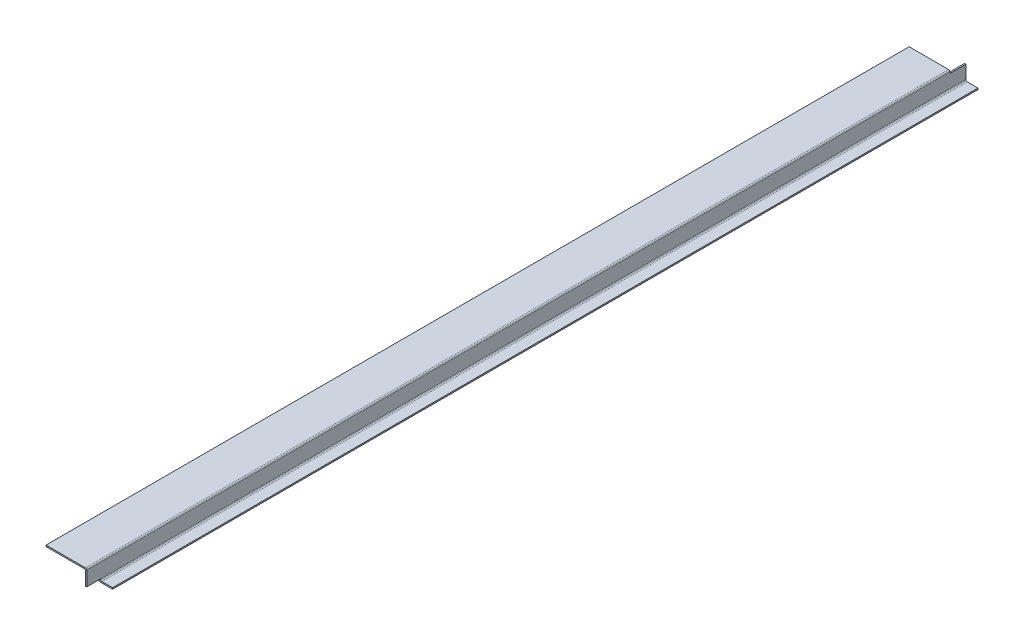
ISO-10303-21;
HEADER;
FILE_DESCRIPTION(('STEP AP214'),'2;1');
FILE_NAME('part.step','',(''),(''),'','','');
FILE_SCHEMA(('AUTOMOTIVE_DESIGN { 1 0 10303 214 1 1 1 1 }'));
ENDSEC;
DATA;
#1=APPLICATION_CONTEXT('core data for automotive mechanical design processes');
#2=APPLICATION_PROTOCOL_DEFINITION('international standard','automotive_design',2000,#1);
#3=PRODUCT_CONTEXT('',#1,'mechanical');
#4=PRODUCT('Part','Part','',(#3));
#5=PRODUCT_RELATED_PRODUCT_CATEGORY('part','',(#4));
#6=PRODUCT_DEFINITION_FORMATION('','',#4);
#7=PRODUCT_DEFINITION_CONTEXT('part definition',#1,'design');
#8=PRODUCT_DEFINITION('design','',#6,#7);
#9=PRODUCT_DEFINITION_SHAPE('','',#8);
#10=(LENGTH_UNIT() NAMED_UNIT(*) SI_UNIT(.MILLI.,.METRE.));
#11=(NAMED_UNIT(*) PLANE_ANGLE_UNIT() SI_UNIT($,.RADIAN.));
#12=(NAMED_UNIT(*) SI_UNIT($,.STERADIAN.) SOLID_ANGLE_UNIT());
#13=UNCERTAINTY_MEASURE_WITH_UNIT(LENGTH_MEASURE(1.E-05),#10,'distance_accuracy_value','');
#14=(GEOMETRIC_REPRESENTATION_CONTEXT(3) GLOBAL_UNCERTAINTY_ASSIGNED_CONTEXT((#13)) GLOBAL_UNIT_ASSIGNED_CONTEXT((#10,
#11,#12)) REPRESENTATION_CONTEXT('',''));
#15=CARTESIAN_POINT('',(0.,0.,0.));
#16=DIRECTION('',(0.,0.,1.));
#17=DIRECTION('',(1.,0.,0.));
#18=AXIS2_PLACEMENT_3D('',#15,#16,#17);
#19=CARTESIAN_POINT('',(0.,0.,0.));
#20=DIRECTION('',(0.,0.,1.));
#21=DIRECTION('',(1.,0.,0.));
#22=AXIS2_PLACEMENT_3D('',#19,#20,#21);
#23=PLANE('',#22);
#24=DIRECTION('',(-1.,0.,0.));
#25=VECTOR('',#24,1.);
#26=CARTESIAN_POINT('',(90.,-3.,0.));
#27=LINE('',#26,#25);
#28=CARTESIAN_POINT('',(90.,-3.,0.));
#29=VERTEX_POINT('',#28);
#30=CARTESIAN_POINT('',(87.,-3.,0.));
#31=VERTEX_POINT('',#30);
#32=EDGE_CURVE('E260',#29,#31,#27,.T.);
#33=ORIENTED_EDGE('',*,*,#32,.F.);
#34=DIRECTION('',(0.,1.,0.));
#35=VECTOR('',#34,1.);
#36=CARTESIAN_POINT('',(90.,3.,0.));
#37=LINE('',#36,#35);
#38=CARTESIAN_POINT('',(90.,-32.,0.));
#39=VERTEX_POINT('',#38);
#40=EDGE_CURVE('E190',#39,#29,#37,.T.);
#41=ORIENTED_EDGE('',*,*,#40,.F.);
#42=CARTESIAN_POINT('',(93.,-32.,0.));
#43=DIRECTION('',(0.,0.,1.));
#44=DIRECTION('',(1.,0.,0.));
#45=AXIS2_PLACEMENT_3D('',#42,#43,#44);
#46=CIRCLE('',#45,3.);
#47=CARTESIAN_POINT('',(93.,-35.,0.));
#48=VERTEX_POINT('',#47);
#49=EDGE_CURVE('E226',#39,#48,#46,.T.);
#50=ORIENTED_EDGE('',*,*,#49,.T.);
#51=DIRECTION('',(-1.,0.,0.));
#52=VECTOR('',#51,1.);
#53=CARTESIAN_POINT('',(90.,-35.,0.));
#54=LINE('',#53,#52);
#55=CARTESIAN_POINT('',(117.,-35.,0.));
#56=VERTEX_POINT('',#55);
#57=EDGE_CURVE('E187',#56,#48,#54,.T.);
#58=ORIENTED_EDGE('',*,*,#57,.F.);
#59=DIRECTION('',(0.,1.,0.));
#60=VECTOR('',#59,1.);
#61=CARTESIAN_POINT('',(117.,-35.,0.));
#62=LINE('',#61,#60);
#63=CARTESIAN_POINT('',(117.,-38.,0.));
#64=VERTEX_POINT('',#63);
#65=EDGE_CURVE('E184',#64,#56,#62,.T.);
#66=ORIENTED_EDGE('',*,*,#65,.F.);
#67=DIRECTION('',(1.,0.,0.));
#68=VECTOR('',#67,1.);
#69=CARTESIAN_POINT('',(87.,-38.,0.));
#70=LINE('',#69,#68);
#71=CARTESIAN_POINT('',(90.,-38.,0.));
#72=VERTEX_POINT('',#71);
#73=EDGE_CURVE('E180',#72,#64,#70,.T.);
#74=ORIENTED_EDGE('',*,*,#73,.F.);
#75=CARTESIAN_POINT('',(90.,-35.,0.));
#76=DIRECTION('',(0.,0.,1.));
#77=DIRECTION('',(1.,0.,0.));
#78=AXIS2_PLACEMENT_3D('',#75,#76,#77);
#79=CIRCLE('',#78,3.);
#80=CARTESIAN_POINT('',(87.,-35.,0.));
#81=VERTEX_POINT('',#80);
#82=EDGE_CURVE('E204',#72,#81,#79,.F.);
#83=ORIENTED_EDGE('',*,*,#82,.T.);
#84=DIRECTION('',(0.,-1.,0.));
#85=VECTOR('',#84,1.);
#86=CARTESIAN_POINT('',(87.,0.,0.));
#87=LINE('',#86,#85);
#88=EDGE_CURVE('E177',#31,#81,#87,.T.);
#89=ORIENTED_EDGE('',*,*,#88,.F.);
#90=EDGE_LOOP('',(#33,#41,#50,#58,#66,#74,#83,#89));
#91=FACE_BOUND('',#90,.T.);
#92=ADVANCED_FACE('F35',(#91),#23,.F.);
#93=CARTESIAN_POINT('',(0.,3.,1940.));
#94=DIRECTION('',(1.,0.,0.));
#95=DIRECTION('',(0.,0.,-1.));
#96=AXIS2_PLACEMENT_3D('',#93,#94,#95);
#97=PLANE('',#96);
#98=DIRECTION('',(0.,0.,-1.));
#99=VECTOR('',#98,1.);
#100=CARTESIAN_POINT('',(0.,3.,1940.));
#101=LINE('',#100,#99);
#102=CARTESIAN_POINT('',(0.,3.,1940.));
#103=VERTEX_POINT('',#102);
#104=CARTESIAN_POINT('',(0.,3.,34.9999999999999));
#105=VERTEX_POINT('',#104);
#106=EDGE_CURVE('E176',#103,#105,#101,.T.);
#107=ORIENTED_EDGE('',*,*,#106,.T.);
#108=DIRECTION('',(0.,1.,0.));
#109=VECTOR('',#108,1.);
#110=CARTESIAN_POINT('',(0.,-3.,34.9999999999999));
#111=LINE('',#110,#109);
#112=CARTESIAN_POINT('',(0.,0.,34.9999999999999));
#113=VERTEX_POINT('',#112);
#114=EDGE_CURVE('E240',#113,#105,#111,.T.);
#115=ORIENTED_EDGE('',*,*,#114,.F.);
#116=DIRECTION('',(0.,0.,-1.));
#117=VECTOR('',#116,1.);
#118=CARTESIAN_POINT('',(0.,0.,1940.));
#119=LINE('',#118,#117);
#120=CARTESIAN_POINT('',(0.,0.,1940.));
#121=VERTEX_POINT('',#120);
#122=EDGE_CURVE('E199',#121,#113,#119,.T.);
#123=ORIENTED_EDGE('',*,*,#122,.F.);
#124=DIRECTION('',(0.,-1.,0.));
#125=VECTOR('',#124,1.);
#126=CARTESIAN_POINT('',(0.,3.,1940.));
#127=LINE('',#126,#125);
#128=EDGE_CURVE('E171',#103,#121,#127,.T.);
#129=ORIENTED_EDGE('',*,*,#128,.F.);
#130=EDGE_LOOP('',(#107,#115,#123,#129));
#131=FACE_BOUND('',#130,.T.);
#132=ADVANCED_FACE('F252',(#131),#97,.F.);
#133=CARTESIAN_POINT('',(0.,0.,1940.));
#134=DIRECTION('',(0.,1.,0.));
#135=DIRECTION('',(0.,0.,1.));
#136=AXIS2_PLACEMENT_3D('',#133,#134,#135);
#137=PLANE('',#136);
#138=ORIENTED_EDGE('',*,*,#122,.T.);
#139=DIRECTION('',(1.,0.,0.));
#140=VECTOR('',#139,1.);
#141=CARTESIAN_POINT('',(0.,0.,34.9999999999999));
#142=LINE('',#141,#140);
#143=CARTESIAN_POINT('',(84.,0.,34.9999999999999));
#144=VERTEX_POINT('',#143);
#145=EDGE_CURVE('E181',#113,#144,#142,.T.);
#146=ORIENTED_EDGE('',*,*,#145,.T.);
#147=DIRECTION('',(0.,0.,-1.));
#148=VECTOR('',#147,1.);
#149=CARTESIAN_POINT('',(84.,0.,1940.));
#150=LINE('',#149,#148);
#151=CARTESIAN_POINT('',(84.,0.,1940.));
#152=VERTEX_POINT('',#151);
#153=EDGE_CURVE('E213',#144,#152,#150,.F.);
#154=ORIENTED_EDGE('',*,*,#153,.T.);
#155=DIRECTION('',(1.,0.,0.));
#156=VECTOR('',#155,1.);
#157=CARTESIAN_POINT('',(0.,0.,1940.));
#158=LINE('',#157,#156);
#159=EDGE_CURVE('E167',#121,#152,#158,.T.);
#160=ORIENTED_EDGE('',*,*,#159,.F.);
#161=EDGE_LOOP('',(#138,#146,#154,#160));
#162=FACE_BOUND('',#161,.T.);
#163=ADVANCED_FACE('F311',(#162),#137,.F.);
#164=CARTESIAN_POINT('',(87.,0.,1940.));
#165=DIRECTION('',(1.,0.,0.));
#166=DIRECTION('',(0.,1.,0.));
#167=AXIS2_PLACEMENT_3D('',#164,#165,#166);
#168=PLANE('',#167);
#169=DIRECTION('',(0.,0.,-1.));
#170=VECTOR('',#169,1.);
#171=CARTESIAN_POINT('',(87.,-35.,1940.));
#172=LINE('',#171,#170);
#173=CARTESIAN_POINT('',(87.,-35.,1910.));
#174=VERTEX_POINT('',#173);
#175=EDGE_CURVE('E209',#81,#174,#172,.F.);
#176=ORIENTED_EDGE('',*,*,#175,.T.);
#177=DIRECTION('',(0.,-1.,0.));
#178=VECTOR('',#177,1.);
#179=CARTESIAN_POINT('',(87.,-32.,1910.));
#180=LINE('',#179,#178);
#181=CARTESIAN_POINT('',(87.,-32.,1910.));
#182=VERTEX_POINT('',#181);
#183=EDGE_CURVE('E160',#182,#174,#180,.T.);
#184=ORIENTED_EDGE('',*,*,#183,.F.);
#185=DIRECTION('',(0.,0.,-1.));
#186=VECTOR('',#185,1.);
#187=CARTESIAN_POINT('',(87.,-32.,1910.));
#188=LINE('',#187,#186);
#189=CARTESIAN_POINT('',(87.,-32.,1940.));
#190=VERTEX_POINT('',#189);
#191=EDGE_CURVE('E143',#190,#182,#188,.T.);
#192=ORIENTED_EDGE('',*,*,#191,.F.);
#193=DIRECTION('',(0.,-1.,0.));
#194=VECTOR('',#193,1.);
#195=CARTESIAN_POINT('',(87.,0.,1940.));
#196=LINE('',#195,#194);
#197=CARTESIAN_POINT('',(87.,-3.,1940.));
#198=VERTEX_POINT('',#197);
#199=EDGE_CURVE('E158',#198,#190,#196,.T.);
#200=ORIENTED_EDGE('',*,*,#199,.F.);
#201=DIRECTION('',(0.,0.,-1.));
#202=VECTOR('',#201,1.);
#203=CARTESIAN_POINT('',(87.,-3.,0.));
#204=LINE('',#203,#202);
#205=CARTESIAN_POINT('',(87.,-3.,34.9999999999999));
#206=VERTEX_POINT('',#205);
#207=EDGE_CURVE('E207',#198,#206,#204,.T.);
#208=ORIENTED_EDGE('',*,*,#207,.T.);
#209=EDGE_CURVE('E206',#206,#31,#204,.T.);
#210=ORIENTED_EDGE('',*,*,#209,.T.);
#211=ORIENTED_EDGE('',*,*,#88,.T.);
#212=EDGE_LOOP('',(#176,#184,#192,#200,#208,#210,#211));
#213=FACE_BOUND('',#212,.T.);
#214=ADVANCED_FACE('F156',(#213),#168,.F.);
#215=CARTESIAN_POINT('',(87.,-38.,1940.));
#216=DIRECTION('',(0.,1.,0.));
#217=DIRECTION('',(0.,0.,1.));
#218=AXIS2_PLACEMENT_3D('',#215,#216,#217);
#219=PLANE('',#218);
#220=DIRECTION('',(0.,0.,-1.));
#221=VECTOR('',#220,1.);
#222=CARTESIAN_POINT('',(117.,-38.,1940.));
#223=LINE('',#222,#221);
#224=CARTESIAN_POINT('',(117.,-38.,1910.));
#225=VERTEX_POINT('',#224);
#226=EDGE_CURVE('E197',#225,#64,#223,.T.);
#227=ORIENTED_EDGE('',*,*,#226,.F.);
#228=DIRECTION('',(1.,0.,0.));
#229=VECTOR('',#228,1.);
#230=CARTESIAN_POINT('',(117.,-38.,1910.));
#231=LINE('',#230,#229);
#232=CARTESIAN_POINT('',(90.,-38.,1910.));
#233=VERTEX_POINT('',#232);
#234=EDGE_CURVE('E151',#233,#225,#231,.T.);
#235=ORIENTED_EDGE('',*,*,#234,.F.);
#236=DIRECTION('',(0.,0.,-1.));
#237=VECTOR('',#236,1.);
#238=CARTESIAN_POINT('',(90.,-38.,1940.));
#239=LINE('',#238,#237);
#240=EDGE_CURVE('E202',#233,#72,#239,.T.);
#241=ORIENTED_EDGE('',*,*,#240,.T.);
#242=ORIENTED_EDGE('',*,*,#73,.T.);
#243=EDGE_LOOP('',(#227,#235,#241,#242));
#244=FACE_BOUND('',#243,.T.);
#245=ADVANCED_FACE('F285',(#244),#219,.F.);
#246=CARTESIAN_POINT('',(117.,-35.,1940.));
#247=DIRECTION('',(-1.,0.,0.));
#248=DIRECTION('',(0.,0.,1.));
#249=AXIS2_PLACEMENT_3D('',#246,#247,#248);
#250=PLANE('',#249);
#251=DIRECTION('',(0.,0.,-1.));
#252=VECTOR('',#251,1.);
#253=CARTESIAN_POINT('',(117.,-35.,1940.));
#254=LINE('',#253,#252);
#255=CARTESIAN_POINT('',(117.,-35.,1910.));
#256=VERTEX_POINT('',#255);
#257=EDGE_CURVE('E195',#256,#56,#254,.T.);
#258=ORIENTED_EDGE('',*,*,#257,.F.);
#259=DIRECTION('',(0.,-1.,0.));
#260=VECTOR('',#259,1.);
#261=CARTESIAN_POINT('',(117.,-32.,1910.));
#262=LINE('',#261,#260);
#263=EDGE_CURVE('E270',#256,#225,#262,.T.);
#264=ORIENTED_EDGE('',*,*,#263,.T.);
#265=ORIENTED_EDGE('',*,*,#226,.T.);
#266=ORIENTED_EDGE('',*,*,#65,.T.);
#267=EDGE_LOOP('',(#258,#264,#265,#266));
#268=FACE_BOUND('',#267,.T.);
#269=ADVANCED_FACE('F284',(#268),#250,.F.);
#270=CARTESIAN_POINT('',(90.,-35.,1940.));
#271=DIRECTION('',(0.,-1.,0.));
#272=DIRECTION('',(0.,0.,-1.));
#273=AXIS2_PLACEMENT_3D('',#270,#271,#272);
#274=PLANE('',#273);
#275=DIRECTION('',(0.,0.,-1.));
#276=VECTOR('',#275,1.);
#277=CARTESIAN_POINT('',(93.,-35.,1940.));
#278=LINE('',#277,#276);
#279=CARTESIAN_POINT('',(93.,-35.,1910.));
#280=VERTEX_POINT('',#279);
#281=EDGE_CURVE('E219',#48,#280,#278,.F.);
#282=ORIENTED_EDGE('',*,*,#281,.T.);
#283=DIRECTION('',(1.,0.,0.));
#284=VECTOR('',#283,1.);
#285=CARTESIAN_POINT('',(90.,-35.,1910.));
#286=LINE('',#285,#284);
#287=EDGE_CURVE('E267',#280,#256,#286,.T.);
#288=ORIENTED_EDGE('',*,*,#287,.T.);
#289=ORIENTED_EDGE('',*,*,#257,.T.);
#290=ORIENTED_EDGE('',*,*,#57,.T.);
#291=EDGE_LOOP('',(#282,#288,#289,#290));
#292=FACE_BOUND('',#291,.T.);
#293=ADVANCED_FACE('F296',(#292),#274,.F.);
#294=CARTESIAN_POINT('',(90.,3.,1940.));
#295=DIRECTION('',(-1.,0.,0.));
#296=DIRECTION('',(0.,0.,1.));
#297=AXIS2_PLACEMENT_3D('',#294,#295,#296);
#298=PLANE('',#297);
#299=DIRECTION('',(0.,0.,-1.));
#300=VECTOR('',#299,1.);
#301=CARTESIAN_POINT('',(90.,-3.,34.9999999999999));
#302=LINE('',#301,#300);
#303=CARTESIAN_POINT('',(90.,-3.,34.9999999999999));
#304=VERTEX_POINT('',#303);
#305=EDGE_CURVE('E238',#304,#29,#302,.T.);
#306=ORIENTED_EDGE('',*,*,#305,.F.);
#307=DIRECTION('',(0.,1.,0.));
#308=VECTOR('',#307,1.);
#309=CARTESIAN_POINT('',(90.,-3.,34.9999999999999));
#310=LINE('',#309,#308);
#311=CARTESIAN_POINT('',(90.,0.,34.9999999999999));
#312=VERTEX_POINT('',#311);
#313=EDGE_CURVE('E231',#304,#312,#310,.T.);
#314=ORIENTED_EDGE('',*,*,#313,.T.);
#315=DIRECTION('',(0.,0.,-1.));
#316=VECTOR('',#315,1.);
#317=CARTESIAN_POINT('',(90.,0.,1940.));
#318=LINE('',#317,#316);
#319=CARTESIAN_POINT('',(90.,0.,1940.));
#320=VERTEX_POINT('',#319);
#321=EDGE_CURVE('E215',#312,#320,#318,.F.);
#322=ORIENTED_EDGE('',*,*,#321,.T.);
#323=DIRECTION('',(0.,1.,0.));
#324=VECTOR('',#323,1.);
#325=CARTESIAN_POINT('',(90.,3.,1940.));
#326=LINE('',#325,#324);
#327=CARTESIAN_POINT('',(90.,-32.,1940.));
#328=VERTEX_POINT('',#327);
#329=EDGE_CURVE('E166',#328,#320,#326,.T.);
#330=ORIENTED_EDGE('',*,*,#329,.F.);
#331=DIRECTION('',(0.,0.,-1.));
#332=VECTOR('',#331,1.);
#333=CARTESIAN_POINT('',(90.,-32.,0.));
#334=LINE('',#333,#332);
#335=CARTESIAN_POINT('',(90.,-32.,1910.));
#336=VERTEX_POINT('',#335);
#337=EDGE_CURVE('E146',#328,#336,#334,.T.);
#338=ORIENTED_EDGE('',*,*,#337,.T.);
#339=EDGE_CURVE('E217',#336,#39,#334,.T.);
#340=ORIENTED_EDGE('',*,*,#339,.T.);
#341=ORIENTED_EDGE('',*,*,#40,.T.);
#342=EDGE_LOOP('',(#306,#314,#322,#330,#338,#340,#341));
#343=FACE_BOUND('',#342,.T.);
#344=ADVANCED_FACE('F237',(#343),#298,.F.);
#345=CARTESIAN_POINT('',(0.,3.,1940.));
#346=DIRECTION('',(0.,-1.,0.));
#347=DIRECTION('',(0.,0.,-1.));
#348=AXIS2_PLACEMENT_3D('',#345,#346,#347);
#349=PLANE('',#348);
#350=DIRECTION('',(0.,0.,-1.));
#351=VECTOR('',#350,1.);
#352=CARTESIAN_POINT('',(87.,3.,1940.));
#353=LINE('',#352,#351);
#354=CARTESIAN_POINT('',(87.,3.,1940.));
#355=VERTEX_POINT('',#354);
#356=CARTESIAN_POINT('',(87.,3.,34.9999999999999));
#357=VERTEX_POINT('',#356);
#358=EDGE_CURVE('E222',#355,#357,#353,.T.);
#359=ORIENTED_EDGE('',*,*,#358,.T.);
#360=DIRECTION('',(1.,0.,0.));
#361=VECTOR('',#360,1.);
#362=CARTESIAN_POINT('',(0.,3.,34.9999999999999));
#363=LINE('',#362,#361);
#364=EDGE_CURVE('E58',#105,#357,#363,.T.);
#365=ORIENTED_EDGE('',*,*,#364,.F.);
#366=ORIENTED_EDGE('',*,*,#106,.F.);
#367=DIRECTION('',(-1.,0.,0.));
#368=VECTOR('',#367,1.);
#369=CARTESIAN_POINT('',(0.,3.,1940.));
#370=LINE('',#369,#368);
#371=EDGE_CURVE('E169',#355,#103,#370,.T.);
#372=ORIENTED_EDGE('',*,*,#371,.F.);
#373=EDGE_LOOP('',(#359,#365,#366,#372));
#374=FACE_BOUND('',#373,.T.);
#375=ADVANCED_FACE('F247',(#374),#349,.F.);
#376=CARTESIAN_POINT('',(0.,0.,1940.));
#377=DIRECTION('',(0.,0.,1.));
#378=DIRECTION('',(1.,0.,0.));
#379=AXIS2_PLACEMENT_3D('',#376,#377,#378);
#380=PLANE('',#379);
#381=DIRECTION('',(-1.,0.,0.));
#382=VECTOR('',#381,1.);
#383=CARTESIAN_POINT('',(87.,-32.,1940.));
#384=LINE('',#383,#382);
#385=EDGE_CURVE('E140',#328,#190,#384,.T.);
#386=ORIENTED_EDGE('',*,*,#385,.F.);
#387=ORIENTED_EDGE('',*,*,#329,.T.);
#388=CARTESIAN_POINT('',(87.,0.,1940.));
#389=DIRECTION('',(0.,0.,1.));
#390=DIRECTION('',(1.,0.,0.));
#391=AXIS2_PLACEMENT_3D('',#388,#389,#390);
#392=CIRCLE('',#391,3.);
#393=EDGE_CURVE('E211',#320,#355,#392,.T.);
#394=ORIENTED_EDGE('',*,*,#393,.T.);
#395=ORIENTED_EDGE('',*,*,#371,.T.);
#396=ORIENTED_EDGE('',*,*,#128,.T.);
#397=ORIENTED_EDGE('',*,*,#159,.T.);
#398=CARTESIAN_POINT('',(84.,-3.,1940.));
#399=DIRECTION('',(0.,0.,1.));
#400=DIRECTION('',(1.,0.,0.));
#401=AXIS2_PLACEMENT_3D('',#398,#399,#400);
#402=CIRCLE('',#401,3.);
#403=EDGE_CURVE('E165',#152,#198,#402,.F.);
#404=ORIENTED_EDGE('',*,*,#403,.T.);
#405=ORIENTED_EDGE('',*,*,#199,.T.);
#406=EDGE_LOOP('',(#386,#387,#394,#395,#396,#397,#404,#405));
#407=FACE_BOUND('',#406,.T.);
#408=ADVANCED_FACE('F162',(#407),#380,.T.);
#409=CARTESIAN_POINT('',(90.,-35.,1940.));
#410=DIRECTION('',(0.,0.,-1.));
#411=DIRECTION('',(-1.,0.,0.));
#412=AXIS2_PLACEMENT_3D('',#409,#410,#411);
#413=CYLINDRICAL_SURFACE('',#412,3.);
#414=CARTESIAN_POINT('',(90.,-35.,1910.));
#415=DIRECTION('',(0.,0.,-1.));
#416=DIRECTION('',(-1.,0.,0.));
#417=AXIS2_PLACEMENT_3D('',#414,#415,#416);
#418=CIRCLE('',#417,3.);
#419=EDGE_CURVE('E261',#174,#233,#418,.F.);
#420=ORIENTED_EDGE('',*,*,#419,.F.);
#421=ORIENTED_EDGE('',*,*,#175,.F.);
#422=ORIENTED_EDGE('',*,*,#82,.F.);
#423=ORIENTED_EDGE('',*,*,#240,.F.);
#424=EDGE_LOOP('',(#420,#421,#422,#423));
#425=FACE_BOUND('',#424,.T.);
#426=ADVANCED_FACE('F302',(#425),#413,.T.);
#427=CARTESIAN_POINT('',(84.,-3.,1940.));
#428=DIRECTION('',(0.,0.,1.));
#429=DIRECTION('',(1.,0.,0.));
#430=AXIS2_PLACEMENT_3D('',#427,#428,#429);
#431=CYLINDRICAL_SURFACE('',#430,3.);
#432=ORIENTED_EDGE('',*,*,#153,.F.);
#433=CARTESIAN_POINT('',(84.,-3.,34.9999999999999));
#434=DIRECTION('',(0.,0.,1.));
#435=DIRECTION('',(1.,0.,0.));
#436=AXIS2_PLACEMENT_3D('',#433,#434,#435);
#437=CIRCLE('',#436,3.);
#438=EDGE_CURVE('E239',#144,#206,#437,.F.);
#439=ORIENTED_EDGE('',*,*,#438,.T.);
#440=ORIENTED_EDGE('',*,*,#207,.F.);
#441=ORIENTED_EDGE('',*,*,#403,.F.);
#442=EDGE_LOOP('',(#432,#439,#440,#441));
#443=FACE_BOUND('',#442,.T.);
#444=ADVANCED_FACE('F309',(#443),#431,.F.);
#445=CARTESIAN_POINT('',(93.,-32.,1940.));
#446=DIRECTION('',(0.,0.,1.));
#447=DIRECTION('',(1.,0.,0.));
#448=AXIS2_PLACEMENT_3D('',#445,#446,#447);
#449=CYLINDRICAL_SURFACE('',#448,3.);
#450=ORIENTED_EDGE('',*,*,#339,.F.);
#451=CARTESIAN_POINT('',(93.,-32.,1910.));
#452=DIRECTION('',(0.,0.,-1.));
#453=DIRECTION('',(-1.,0.,0.));
#454=AXIS2_PLACEMENT_3D('',#451,#452,#453);
#455=CIRCLE('',#454,3.);
#456=EDGE_CURVE('E11',#336,#280,#455,.F.);
#457=ORIENTED_EDGE('',*,*,#456,.T.);
#458=ORIENTED_EDGE('',*,*,#281,.F.);
#459=ORIENTED_EDGE('',*,*,#49,.F.);
#460=EDGE_LOOP('',(#450,#457,#458,#459));
#461=FACE_BOUND('',#460,.T.);
#462=ADVANCED_FACE('F299',(#461),#449,.F.);
#463=CARTESIAN_POINT('',(87.,0.,1940.));
#464=DIRECTION('',(0.,0.,-1.));
#465=DIRECTION('',(-1.,0.,0.));
#466=AXIS2_PLACEMENT_3D('',#463,#464,#465);
#467=CYLINDRICAL_SURFACE('',#466,3.);
#468=CARTESIAN_POINT('',(87.,0.,34.9999999999999));
#469=DIRECTION('',(0.,0.,1.));
#470=DIRECTION('',(1.,0.,0.));
#471=AXIS2_PLACEMENT_3D('',#468,#469,#470);
#472=CIRCLE('',#471,3.);
#473=EDGE_CURVE('E43',#357,#312,#472,.F.);
#474=ORIENTED_EDGE('',*,*,#473,.F.);
#475=ORIENTED_EDGE('',*,*,#358,.F.);
#476=ORIENTED_EDGE('',*,*,#393,.F.);
#477=ORIENTED_EDGE('',*,*,#321,.F.);
#478=EDGE_LOOP('',(#474,#475,#476,#477));
#479=FACE_BOUND('',#478,.T.);
#480=ADVANCED_FACE('F37',(#479),#467,.T.);
#481=CARTESIAN_POINT('',(0.,-3.,0.));
#482=DIRECTION('',(0.,1.,0.));
#483=DIRECTION('',(0.,0.,1.));
#484=AXIS2_PLACEMENT_3D('',#481,#482,#483);
#485=PLANE('',#484);
#486=ORIENTED_EDGE('',*,*,#209,.F.);
#487=DIRECTION('',(1.,0.,0.));
#488=VECTOR('',#487,1.);
#489=CARTESIAN_POINT('',(0.,-3.,34.9999999999999));
#490=LINE('',#489,#488);
#491=EDGE_CURVE('E263',#206,#304,#490,.T.);
#492=ORIENTED_EDGE('',*,*,#491,.T.);
#493=ORIENTED_EDGE('',*,*,#305,.T.);
#494=ORIENTED_EDGE('',*,*,#32,.T.);
#495=EDGE_LOOP('',(#486,#492,#493,#494));
#496=FACE_BOUND('',#495,.T.);
#497=ADVANCED_FACE('F306',(#496),#485,.T.);
#498=CARTESIAN_POINT('',(0.,-3.,34.9999999999999));
#499=DIRECTION('',(0.,0.,1.));
#500=DIRECTION('',(1.,0.,0.));
#501=AXIS2_PLACEMENT_3D('',#498,#499,#500);
#502=PLANE('',#501);
#503=ORIENTED_EDGE('',*,*,#114,.T.);
#504=ORIENTED_EDGE('',*,*,#364,.T.);
#505=ORIENTED_EDGE('',*,*,#473,.T.);
#506=ORIENTED_EDGE('',*,*,#313,.F.);
#507=ORIENTED_EDGE('',*,*,#491,.F.);
#508=ORIENTED_EDGE('',*,*,#438,.F.);
#509=ORIENTED_EDGE('',*,*,#145,.F.);
#510=EDGE_LOOP('',(#503,#504,#505,#506,#507,#508,#509));
#511=FACE_BOUND('',#510,.T.);
#512=ADVANCED_FACE('F229',(#511),#502,.F.);
#513=CARTESIAN_POINT('',(117.,-32.,1910.));
#514=DIRECTION('',(0.,0.,-1.));
#515=DIRECTION('',(-1.,0.,0.));
#516=AXIS2_PLACEMENT_3D('',#513,#514,#515);
#517=PLANE('',#516);
#518=ORIENTED_EDGE('',*,*,#419,.T.);
#519=ORIENTED_EDGE('',*,*,#234,.T.);
#520=ORIENTED_EDGE('',*,*,#263,.F.);
#521=ORIENTED_EDGE('',*,*,#287,.F.);
#522=ORIENTED_EDGE('',*,*,#456,.F.);
#523=DIRECTION('',(1.,0.,0.));
#524=VECTOR('',#523,1.);
#525=CARTESIAN_POINT('',(117.,-32.,1910.));
#526=LINE('',#525,#524);
#527=EDGE_CURVE('E50',#182,#336,#526,.T.);
#528=ORIENTED_EDGE('',*,*,#527,.F.);
#529=ORIENTED_EDGE('',*,*,#183,.T.);
#530=EDGE_LOOP('',(#518,#519,#520,#521,#522,#528,#529));
#531=FACE_BOUND('',#530,.T.);
#532=ADVANCED_FACE('F277',(#531),#517,.F.);
#533=CARTESIAN_POINT('',(0.,-32.,0.));
#534=DIRECTION('',(0.,1.,0.));
#535=DIRECTION('',(0.,0.,1.));
#536=AXIS2_PLACEMENT_3D('',#533,#534,#535);
#537=PLANE('',#536);
#538=ORIENTED_EDGE('',*,*,#385,.T.);
#539=ORIENTED_EDGE('',*,*,#191,.T.);
#540=ORIENTED_EDGE('',*,*,#527,.T.);
#541=ORIENTED_EDGE('',*,*,#337,.F.);
#542=EDGE_LOOP('',(#538,#539,#540,#541));
#543=FACE_BOUND('',#542,.T.);
#544=ADVANCED_FACE('F142',(#543),#537,.F.);
#545=CLOSED_SHELL('',(#92,#132,#163,#214,#245,#269,#293,#344,#375,#408,#426,#444,#462,#480,#497,
#512,#532,#544));
#546=MANIFOLD_SOLID_BREP('B2',#545);
#547=ADVANCED_BREP_SHAPE_REPRESENTATION('',(#18,#546),#14);
#548=SHAPE_DEFINITION_REPRESENTATION(#9,#547);
ENDSEC;
END-ISO-10303-21;
